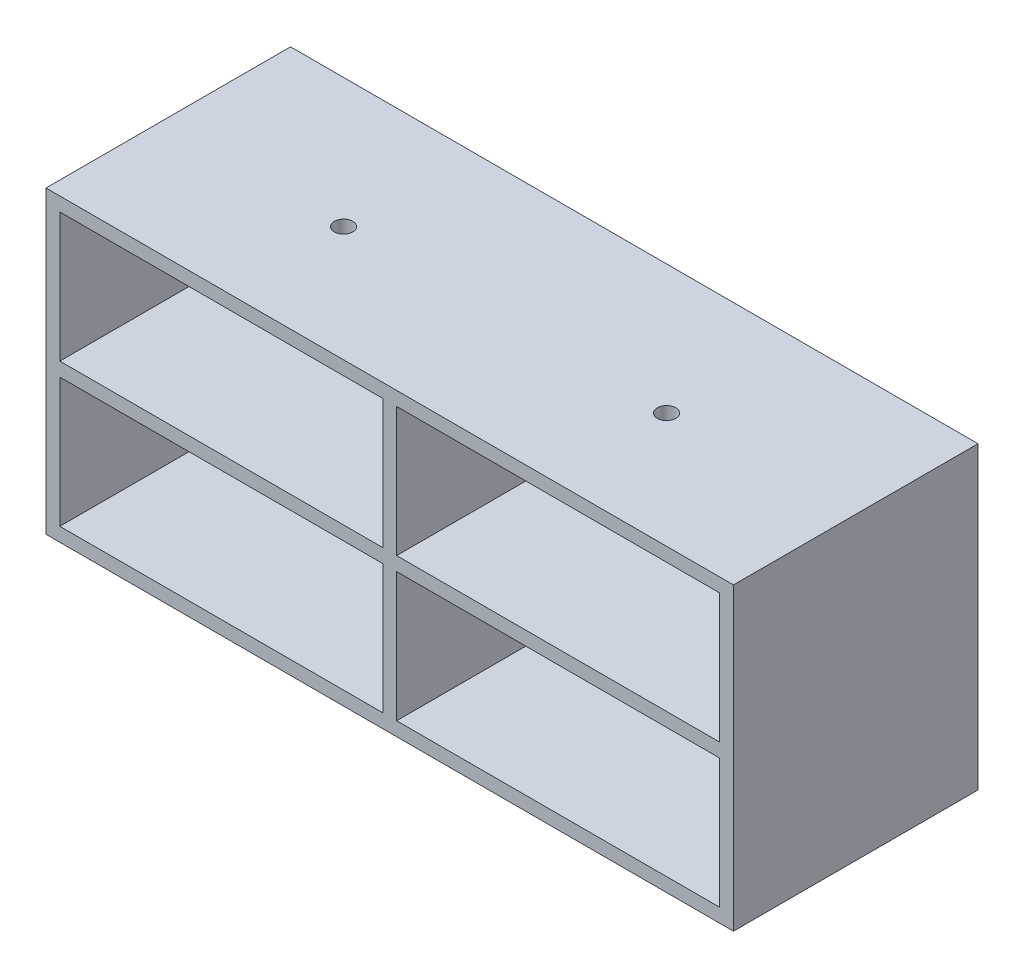
ISO-10303-21;
HEADER;
FILE_DESCRIPTION(('STEP AP214'),'2;1');
FILE_NAME('part.step','',(''),(''),'','','');
FILE_SCHEMA(('AUTOMOTIVE_DESIGN { 1 0 10303 214 1 1 1 1 }'));
ENDSEC;
DATA;
#1=APPLICATION_CONTEXT('core data for automotive mechanical design processes');
#2=APPLICATION_PROTOCOL_DEFINITION('international standard','automotive_design',2000,#1);
#3=PRODUCT_CONTEXT('',#1,'mechanical');
#4=PRODUCT('Part','Part','',(#3));
#5=PRODUCT_RELATED_PRODUCT_CATEGORY('part','',(#4));
#6=PRODUCT_DEFINITION_FORMATION('','',#4);
#7=PRODUCT_DEFINITION_CONTEXT('part definition',#1,'design');
#8=PRODUCT_DEFINITION('design','',#6,#7);
#9=PRODUCT_DEFINITION_SHAPE('','',#8);
#10=(LENGTH_UNIT() NAMED_UNIT(*) SI_UNIT(.MILLI.,.METRE.));
#11=(NAMED_UNIT(*) PLANE_ANGLE_UNIT() SI_UNIT($,.RADIAN.));
#12=(NAMED_UNIT(*) SI_UNIT($,.STERADIAN.) SOLID_ANGLE_UNIT());
#13=UNCERTAINTY_MEASURE_WITH_UNIT(LENGTH_MEASURE(1.E-05),#10,'distance_accuracy_value','');
#14=(GEOMETRIC_REPRESENTATION_CONTEXT(3) GLOBAL_UNCERTAINTY_ASSIGNED_CONTEXT((#13)) GLOBAL_UNIT_ASSIGNED_CONTEXT((#10,
#11,#12)) REPRESENTATION_CONTEXT('',''));
#15=CARTESIAN_POINT('',(0.,0.,0.));
#16=DIRECTION('',(0.,0.,1.));
#17=DIRECTION('',(1.,0.,0.));
#18=AXIS2_PLACEMENT_3D('',#15,#16,#17);
#19=CARTESIAN_POINT('',(146.,-62.,53.));
#20=DIRECTION('',(-1.,0.,0.));
#21=DIRECTION('',(0.,0.,1.));
#22=AXIS2_PLACEMENT_3D('',#19,#20,#21);
#23=PLANE('',#22);
#24=DIRECTION('',(0.,1.,0.));
#25=VECTOR('',#24,1.);
#26=CARTESIAN_POINT('',(146.,-62.,53.));
#27=LINE('',#26,#25);
#28=CARTESIAN_POINT('',(146.,-62.,53.));
#29=VERTEX_POINT('',#28);
#30=CARTESIAN_POINT('',(146.,-34.,53.));
#31=VERTEX_POINT('',#30);
#32=EDGE_CURVE('E250',#29,#31,#27,.T.);
#33=ORIENTED_EDGE('',*,*,#32,.T.);
#34=DIRECTION('',(0.,0.,-1.));
#35=VECTOR('',#34,1.);
#36=CARTESIAN_POINT('',(146.,-34.,207.693244842818));
#37=LINE('',#36,#35);
#38=CARTESIAN_POINT('',(146.,-34.,3.));
#39=VERTEX_POINT('',#38);
#40=EDGE_CURVE('E243',#31,#39,#37,.T.);
#41=ORIENTED_EDGE('',*,*,#40,.T.);
#42=DIRECTION('',(0.,1.,0.));
#43=VECTOR('',#42,1.);
#44=CARTESIAN_POINT('',(146.,-62.,3.));
#45=LINE('',#44,#43);
#46=CARTESIAN_POINT('',(146.,-62.,3.));
#47=VERTEX_POINT('',#46);
#48=EDGE_CURVE('E198',#47,#39,#45,.T.);
#49=ORIENTED_EDGE('',*,*,#48,.F.);
#50=DIRECTION('',(0.,0.,-1.));
#51=VECTOR('',#50,1.);
#52=CARTESIAN_POINT('',(146.,-62.,53.));
#53=LINE('',#52,#51);
#54=EDGE_CURVE('E263',#29,#47,#53,.T.);
#55=ORIENTED_EDGE('',*,*,#54,.F.);
#56=EDGE_LOOP('',(#33,#41,#49,#55));
#57=FACE_BOUND('',#56,.T.);
#58=ADVANCED_FACE('F37',(#57),#23,.T.);
#59=CARTESIAN_POINT('',(146.,-31.,3.));
#60=VERTEX_POINT('',#59);
#61=CARTESIAN_POINT('',(146.,-3.,3.));
#62=VERTEX_POINT('',#61);
#63=EDGE_CURVE('E59',#60,#62,#45,.T.);
#64=ORIENTED_EDGE('',*,*,#63,.F.);
#65=DIRECTION('',(0.,0.,-1.));
#66=VECTOR('',#65,1.);
#67=CARTESIAN_POINT('',(146.,-31.,207.693244842818));
#68=LINE('',#67,#66);
#69=CARTESIAN_POINT('',(146.,-31.,53.));
#70=VERTEX_POINT('',#69);
#71=EDGE_CURVE('E246',#70,#60,#68,.T.);
#72=ORIENTED_EDGE('',*,*,#71,.F.);
#73=CARTESIAN_POINT('',(146.,-3.,53.));
#74=VERTEX_POINT('',#73);
#75=EDGE_CURVE('E195',#70,#74,#27,.T.);
#76=ORIENTED_EDGE('',*,*,#75,.T.);
#77=DIRECTION('',(0.,0.,-1.));
#78=VECTOR('',#77,1.);
#79=CARTESIAN_POINT('',(146.,-3.,53.));
#80=LINE('',#79,#78);
#81=EDGE_CURVE('E285',#74,#62,#80,.T.);
#82=ORIENTED_EDGE('',*,*,#81,.T.);
#83=EDGE_LOOP('',(#64,#72,#76,#82));
#84=FACE_BOUND('',#83,.T.);
#85=ADVANCED_FACE('F341',(#84),#23,.T.);
#86=CARTESIAN_POINT('',(146.,-3.,53.));
#87=DIRECTION('',(0.,-1.,0.));
#88=DIRECTION('',(1.,0.,0.));
#89=AXIS2_PLACEMENT_3D('',#86,#87,#88);
#90=PLANE('',#89);
#91=CARTESIAN_POINT('',(39.5,-3.,28.));
#92=DIRECTION('',(0.,-1.,0.));
#93=DIRECTION('',(1.,0.,0.));
#94=AXIS2_PLACEMENT_3D('',#91,#92,#93);
#95=CIRCLE('',#94,2.);
#96=CARTESIAN_POINT('',(41.5,-3.,28.));
#97=VERTEX_POINT('',#96);
#98=EDGE_CURVE('E249',#97,#97,#95,.F.);
#99=ORIENTED_EDGE('',*,*,#98,.T.);
#100=EDGE_LOOP('',(#99));
#101=FACE_BOUND('',#100,.T.);
#102=DIRECTION('',(-1.,0.,0.));
#103=VECTOR('',#102,1.);
#104=CARTESIAN_POINT('',(146.,-3.,3.));
#105=LINE('',#104,#103);
#106=CARTESIAN_POINT('',(73.,-3.,3.));
#107=VERTEX_POINT('',#106);
#108=CARTESIAN_POINT('',(3.,-3.,3.));
#109=VERTEX_POINT('',#108);
#110=EDGE_CURVE('E266',#107,#109,#105,.T.);
#111=ORIENTED_EDGE('',*,*,#110,.F.);
#112=DIRECTION('',(0.,0.,-1.));
#113=VECTOR('',#112,1.);
#114=CARTESIAN_POINT('',(73.,-3.,207.693244842818));
#115=LINE('',#114,#113);
#116=CARTESIAN_POINT('',(73.,-3.,53.));
#117=VERTEX_POINT('',#116);
#118=EDGE_CURVE('E220',#117,#107,#115,.T.);
#119=ORIENTED_EDGE('',*,*,#118,.F.);
#120=DIRECTION('',(-1.,0.,0.));
#121=VECTOR('',#120,1.);
#122=CARTESIAN_POINT('',(146.,-3.,53.));
#123=LINE('',#122,#121);
#124=CARTESIAN_POINT('',(3.,-3.,53.));
#125=VERTEX_POINT('',#124);
#126=EDGE_CURVE('E253',#117,#125,#123,.T.);
#127=ORIENTED_EDGE('',*,*,#126,.T.);
#128=DIRECTION('',(0.,0.,-1.));
#129=VECTOR('',#128,1.);
#130=CARTESIAN_POINT('',(3.,-3.,53.));
#131=LINE('',#130,#129);
#132=EDGE_CURVE('E282',#125,#109,#131,.T.);
#133=ORIENTED_EDGE('',*,*,#132,.T.);
#134=EDGE_LOOP('',(#111,#119,#127,#133));
#135=FACE_BOUND('',#134,.T.);
#136=ADVANCED_FACE('F347',(#101,#135),#90,.T.);
#137=CARTESIAN_POINT('',(109.5,-3.,28.));
#138=DIRECTION('',(0.,-1.,0.));
#139=DIRECTION('',(1.,0.,0.));
#140=AXIS2_PLACEMENT_3D('',#137,#138,#139);
#141=CIRCLE('',#140,2.);
#142=CARTESIAN_POINT('',(111.5,-3.,28.));
#143=VERTEX_POINT('',#142);
#144=EDGE_CURVE('E375',#143,#143,#141,.F.);
#145=ORIENTED_EDGE('',*,*,#144,.T.);
#146=EDGE_LOOP('',(#145));
#147=FACE_BOUND('',#146,.T.);
#148=CARTESIAN_POINT('',(76.,-3.,53.));
#149=VERTEX_POINT('',#148);
#150=EDGE_CURVE('E254',#74,#149,#123,.T.);
#151=ORIENTED_EDGE('',*,*,#150,.T.);
#152=DIRECTION('',(0.,0.,-1.));
#153=VECTOR('',#152,1.);
#154=CARTESIAN_POINT('',(76.,-3.,207.693244842818));
#155=LINE('',#154,#153);
#156=CARTESIAN_POINT('',(76.,-3.,3.));
#157=VERTEX_POINT('',#156);
#158=EDGE_CURVE('E186',#149,#157,#155,.T.);
#159=ORIENTED_EDGE('',*,*,#158,.T.);
#160=EDGE_CURVE('E267',#62,#157,#105,.T.);
#161=ORIENTED_EDGE('',*,*,#160,.F.);
#162=ORIENTED_EDGE('',*,*,#81,.F.);
#163=EDGE_LOOP('',(#151,#159,#161,#162));
#164=FACE_BOUND('',#163,.T.);
#165=ADVANCED_FACE('F420',(#147,#164),#90,.T.);
#166=CARTESIAN_POINT('',(3.,-3.,53.));
#167=DIRECTION('',(1.,0.,0.));
#168=DIRECTION('',(0.,0.,-1.));
#169=AXIS2_PLACEMENT_3D('',#166,#167,#168);
#170=PLANE('',#169);
#171=DIRECTION('',(0.,-1.,0.));
#172=VECTOR('',#171,1.);
#173=CARTESIAN_POINT('',(3.,-3.,53.));
#174=LINE('',#173,#172);
#175=CARTESIAN_POINT('',(3.,-31.,53.));
#176=VERTEX_POINT('',#175);
#177=EDGE_CURVE('E257',#125,#176,#174,.T.);
#178=ORIENTED_EDGE('',*,*,#177,.T.);
#179=DIRECTION('',(0.,0.,-1.));
#180=VECTOR('',#179,1.);
#181=CARTESIAN_POINT('',(3.,-31.,207.693244842818));
#182=LINE('',#181,#180);
#183=CARTESIAN_POINT('',(3.,-31.,3.));
#184=VERTEX_POINT('',#183);
#185=EDGE_CURVE('E225',#176,#184,#182,.T.);
#186=ORIENTED_EDGE('',*,*,#185,.T.);
#187=DIRECTION('',(0.,-1.,0.));
#188=VECTOR('',#187,1.);
#189=CARTESIAN_POINT('',(3.,-3.,3.));
#190=LINE('',#189,#188);
#191=EDGE_CURVE('E270',#109,#184,#190,.T.);
#192=ORIENTED_EDGE('',*,*,#191,.F.);
#193=ORIENTED_EDGE('',*,*,#132,.F.);
#194=EDGE_LOOP('',(#178,#186,#192,#193));
#195=FACE_BOUND('',#194,.T.);
#196=ADVANCED_FACE('F397',(#195),#170,.T.);
#197=CARTESIAN_POINT('',(3.,-34.,3.));
#198=VERTEX_POINT('',#197);
#199=CARTESIAN_POINT('',(3.,-62.,3.));
#200=VERTEX_POINT('',#199);
#201=EDGE_CURVE('E269',#198,#200,#190,.T.);
#202=ORIENTED_EDGE('',*,*,#201,.F.);
#203=DIRECTION('',(0.,0.,-1.));
#204=VECTOR('',#203,1.);
#205=CARTESIAN_POINT('',(3.,-34.,207.693244842818));
#206=LINE('',#205,#204);
#207=CARTESIAN_POINT('',(3.,-34.,53.));
#208=VERTEX_POINT('',#207);
#209=EDGE_CURVE('E228',#208,#198,#206,.T.);
#210=ORIENTED_EDGE('',*,*,#209,.F.);
#211=CARTESIAN_POINT('',(3.,-62.,53.));
#212=VERTEX_POINT('',#211);
#213=EDGE_CURVE('E256',#208,#212,#174,.T.);
#214=ORIENTED_EDGE('',*,*,#213,.T.);
#215=DIRECTION('',(0.,0.,-1.));
#216=VECTOR('',#215,1.);
#217=CARTESIAN_POINT('',(3.,-62.,53.));
#218=LINE('',#217,#216);
#219=EDGE_CURVE('E279',#212,#200,#218,.T.);
#220=ORIENTED_EDGE('',*,*,#219,.T.);
#221=EDGE_LOOP('',(#202,#210,#214,#220));
#222=FACE_BOUND('',#221,.T.);
#223=ADVANCED_FACE('F417',(#222),#170,.T.);
#224=CARTESIAN_POINT('',(3.,-62.,53.));
#225=DIRECTION('',(0.,1.,0.));
#226=DIRECTION('',(-1.,0.,0.));
#227=AXIS2_PLACEMENT_3D('',#224,#225,#226);
#228=PLANE('',#227);
#229=DIRECTION('',(1.,0.,0.));
#230=VECTOR('',#229,1.);
#231=CARTESIAN_POINT('',(3.,-62.,53.));
#232=LINE('',#231,#230);
#233=CARTESIAN_POINT('',(73.,-62.,53.));
#234=VERTEX_POINT('',#233);
#235=EDGE_CURVE('E261',#212,#234,#232,.T.);
#236=ORIENTED_EDGE('',*,*,#235,.T.);
#237=DIRECTION('',(0.,0.,-1.));
#238=VECTOR('',#237,1.);
#239=CARTESIAN_POINT('',(73.,-62.,207.693244842818));
#240=LINE('',#239,#238);
#241=CARTESIAN_POINT('',(73.,-62.,3.));
#242=VERTEX_POINT('',#241);
#243=EDGE_CURVE('E234',#234,#242,#240,.T.);
#244=ORIENTED_EDGE('',*,*,#243,.T.);
#245=DIRECTION('',(1.,0.,0.));
#246=VECTOR('',#245,1.);
#247=CARTESIAN_POINT('',(3.,-62.,3.));
#248=LINE('',#247,#246);
#249=EDGE_CURVE('E274',#200,#242,#248,.T.);
#250=ORIENTED_EDGE('',*,*,#249,.F.);
#251=ORIENTED_EDGE('',*,*,#219,.F.);
#252=EDGE_LOOP('',(#236,#244,#250,#251));
#253=FACE_BOUND('',#252,.T.);
#254=ADVANCED_FACE('F415',(#253),#228,.T.);
#255=CARTESIAN_POINT('',(76.,-62.,3.));
#256=VERTEX_POINT('',#255);
#257=EDGE_CURVE('E273',#256,#47,#248,.T.);
#258=ORIENTED_EDGE('',*,*,#257,.F.);
#259=DIRECTION('',(0.,0.,-1.));
#260=VECTOR('',#259,1.);
#261=CARTESIAN_POINT('',(76.,-62.,207.693244842818));
#262=LINE('',#261,#260);
#263=CARTESIAN_POINT('',(76.,-62.,53.));
#264=VERTEX_POINT('',#263);
#265=EDGE_CURVE('E237',#264,#256,#262,.T.);
#266=ORIENTED_EDGE('',*,*,#265,.F.);
#267=EDGE_CURVE('E260',#264,#29,#232,.T.);
#268=ORIENTED_EDGE('',*,*,#267,.T.);
#269=ORIENTED_EDGE('',*,*,#54,.T.);
#270=EDGE_LOOP('',(#258,#266,#268,#269));
#271=FACE_BOUND('',#270,.T.);
#272=ADVANCED_FACE('F359',(#271),#228,.T.);
#273=CARTESIAN_POINT('',(0.,0.,3.));
#274=DIRECTION('',(0.,0.,1.));
#275=DIRECTION('',(1.,0.,0.));
#276=AXIS2_PLACEMENT_3D('',#273,#274,#275);
#277=PLANE('',#276);
#278=DIRECTION('',(-1.,0.,0.));
#279=VECTOR('',#278,1.);
#280=CARTESIAN_POINT('',(73.,-31.,3.));
#281=LINE('',#280,#279);
#282=CARTESIAN_POINT('',(73.,-31.,3.));
#283=VERTEX_POINT('',#282);
#284=EDGE_CURVE('E224',#283,#184,#281,.T.);
#285=ORIENTED_EDGE('',*,*,#284,.F.);
#286=DIRECTION('',(0.,-1.,0.));
#287=VECTOR('',#286,1.);
#288=CARTESIAN_POINT('',(73.,-3.,3.));
#289=LINE('',#288,#287);
#290=EDGE_CURVE('E204',#107,#283,#289,.T.);
#291=ORIENTED_EDGE('',*,*,#290,.F.);
#292=ORIENTED_EDGE('',*,*,#110,.T.);
#293=ORIENTED_EDGE('',*,*,#191,.T.);
#294=EDGE_LOOP('',(#285,#291,#292,#293));
#295=FACE_BOUND('',#294,.T.);
#296=ADVANCED_FACE('F355',(#295),#277,.T.);
#297=DIRECTION('',(0.,-1.,0.));
#298=VECTOR('',#297,1.);
#299=CARTESIAN_POINT('',(73.,-34.,3.));
#300=LINE('',#299,#298);
#301=CARTESIAN_POINT('',(73.,-34.,3.));
#302=VERTEX_POINT('',#301);
#303=EDGE_CURVE('E233',#302,#242,#300,.T.);
#304=ORIENTED_EDGE('',*,*,#303,.F.);
#305=DIRECTION('',(1.,0.,0.));
#306=VECTOR('',#305,1.);
#307=CARTESIAN_POINT('',(3.,-34.,3.));
#308=LINE('',#307,#306);
#309=EDGE_CURVE('E230',#198,#302,#308,.T.);
#310=ORIENTED_EDGE('',*,*,#309,.F.);
#311=ORIENTED_EDGE('',*,*,#201,.T.);
#312=ORIENTED_EDGE('',*,*,#249,.T.);
#313=EDGE_LOOP('',(#304,#310,#311,#312));
#314=FACE_BOUND('',#313,.T.);
#315=ADVANCED_FACE('F358',(#314),#277,.T.);
#316=DIRECTION('',(1.,0.,0.));
#317=VECTOR('',#316,1.);
#318=CARTESIAN_POINT('',(76.,-34.,3.));
#319=LINE('',#318,#317);
#320=CARTESIAN_POINT('',(76.,-34.,3.));
#321=VERTEX_POINT('',#320);
#322=EDGE_CURVE('E242',#321,#39,#319,.T.);
#323=ORIENTED_EDGE('',*,*,#322,.F.);
#324=DIRECTION('',(0.,1.,0.));
#325=VECTOR('',#324,1.);
#326=CARTESIAN_POINT('',(76.,-62.,3.));
#327=LINE('',#326,#325);
#328=EDGE_CURVE('E239',#256,#321,#327,.T.);
#329=ORIENTED_EDGE('',*,*,#328,.F.);
#330=ORIENTED_EDGE('',*,*,#257,.T.);
#331=ORIENTED_EDGE('',*,*,#48,.T.);
#332=EDGE_LOOP('',(#323,#329,#330,#331));
#333=FACE_BOUND('',#332,.T.);
#334=ADVANCED_FACE('F435',(#333),#277,.T.);
#335=DIRECTION('',(0.,1.,0.));
#336=VECTOR('',#335,1.);
#337=CARTESIAN_POINT('',(76.,-31.,3.));
#338=LINE('',#337,#336);
#339=CARTESIAN_POINT('',(76.,-31.,3.));
#340=VERTEX_POINT('',#339);
#341=EDGE_CURVE('E180',#340,#157,#338,.T.);
#342=ORIENTED_EDGE('',*,*,#341,.F.);
#343=DIRECTION('',(-1.,0.,0.));
#344=VECTOR('',#343,1.);
#345=CARTESIAN_POINT('',(146.,-31.,3.));
#346=LINE('',#345,#344);
#347=EDGE_CURVE('E52',#60,#340,#346,.T.);
#348=ORIENTED_EDGE('',*,*,#347,.F.);
#349=ORIENTED_EDGE('',*,*,#63,.T.);
#350=ORIENTED_EDGE('',*,*,#160,.T.);
#351=EDGE_LOOP('',(#342,#348,#349,#350));
#352=FACE_BOUND('',#351,.T.);
#353=ADVANCED_FACE('F339',(#352),#277,.T.);
#354=CARTESIAN_POINT('',(0.,0.,3.));
#355=DIRECTION('',(1.,0.,0.));
#356=DIRECTION('',(0.,1.,0.));
#357=AXIS2_PLACEMENT_3D('',#354,#355,#356);
#358=PLANE('',#357);
#359=DIRECTION('',(0.,-1.,0.));
#360=VECTOR('',#359,1.);
#361=CARTESIAN_POINT('',(0.,0.,0.));
#362=LINE('',#361,#360);
#363=CARTESIAN_POINT('',(0.,0.,0.));
#364=VERTEX_POINT('',#363);
#365=CARTESIAN_POINT('',(0.,-65.,0.));
#366=VERTEX_POINT('',#365);
#367=EDGE_CURVE('E300',#364,#366,#362,.T.);
#368=ORIENTED_EDGE('',*,*,#367,.T.);
#369=DIRECTION('',(0.,0.,-1.));
#370=VECTOR('',#369,1.);
#371=CARTESIAN_POINT('',(0.,-65.,3.));
#372=LINE('',#371,#370);
#373=CARTESIAN_POINT('',(0.,-65.,53.));
#374=VERTEX_POINT('',#373);
#375=EDGE_CURVE('E11',#374,#366,#372,.T.);
#376=ORIENTED_EDGE('',*,*,#375,.F.);
#377=DIRECTION('',(0.,-1.,0.));
#378=VECTOR('',#377,1.);
#379=CARTESIAN_POINT('',(0.,0.,53.));
#380=LINE('',#379,#378);
#381=CARTESIAN_POINT('',(0.,0.,53.));
#382=VERTEX_POINT('',#381);
#383=EDGE_CURVE('E291',#382,#374,#380,.T.);
#384=ORIENTED_EDGE('',*,*,#383,.F.);
#385=DIRECTION('',(0.,0.,-1.));
#386=VECTOR('',#385,1.);
#387=CARTESIAN_POINT('',(0.,0.,3.));
#388=LINE('',#387,#386);
#389=EDGE_CURVE('E309',#382,#364,#388,.T.);
#390=ORIENTED_EDGE('',*,*,#389,.T.);
#391=EDGE_LOOP('',(#368,#376,#384,#390));
#392=FACE_BOUND('',#391,.T.);
#393=ADVANCED_FACE('F39',(#392),#358,.F.);
#394=CARTESIAN_POINT('',(0.,-65.,3.));
#395=DIRECTION('',(0.,1.,0.));
#396=DIRECTION('',(0.,0.,1.));
#397=AXIS2_PLACEMENT_3D('',#394,#395,#396);
#398=PLANE('',#397);
#399=DIRECTION('',(1.,0.,0.));
#400=VECTOR('',#399,1.);
#401=CARTESIAN_POINT('',(0.,-65.,0.));
#402=LINE('',#401,#400);
#403=CARTESIAN_POINT('',(149.,-65.,0.));
#404=VERTEX_POINT('',#403);
#405=EDGE_CURVE('E303',#366,#404,#402,.T.);
#406=ORIENTED_EDGE('',*,*,#405,.T.);
#407=DIRECTION('',(0.,0.,-1.));
#408=VECTOR('',#407,1.);
#409=CARTESIAN_POINT('',(149.,-65.,3.));
#410=LINE('',#409,#408);
#411=CARTESIAN_POINT('',(149.,-65.,53.));
#412=VERTEX_POINT('',#411);
#413=EDGE_CURVE('E45',#412,#404,#410,.T.);
#414=ORIENTED_EDGE('',*,*,#413,.F.);
#415=DIRECTION('',(1.,0.,0.));
#416=VECTOR('',#415,1.);
#417=CARTESIAN_POINT('',(0.,-65.,53.));
#418=LINE('',#417,#416);
#419=EDGE_CURVE('E294',#374,#412,#418,.T.);
#420=ORIENTED_EDGE('',*,*,#419,.F.);
#421=ORIENTED_EDGE('',*,*,#375,.T.);
#422=EDGE_LOOP('',(#406,#414,#420,#421));
#423=FACE_BOUND('',#422,.T.);
#424=ADVANCED_FACE('F332',(#423),#398,.F.);
#425=CARTESIAN_POINT('',(149.,0.,3.));
#426=DIRECTION('',(-1.,0.,0.));
#427=DIRECTION('',(0.,-1.,0.));
#428=AXIS2_PLACEMENT_3D('',#425,#426,#427);
#429=PLANE('',#428);
#430=DIRECTION('',(0.,1.,0.));
#431=VECTOR('',#430,1.);
#432=CARTESIAN_POINT('',(149.,0.,0.));
#433=LINE('',#432,#431);
#434=CARTESIAN_POINT('',(149.,0.,0.));
#435=VERTEX_POINT('',#434);
#436=EDGE_CURVE('E305',#404,#435,#433,.T.);
#437=ORIENTED_EDGE('',*,*,#436,.T.);
#438=DIRECTION('',(0.,0.,-1.));
#439=VECTOR('',#438,1.);
#440=CARTESIAN_POINT('',(149.,0.,3.));
#441=LINE('',#440,#439);
#442=CARTESIAN_POINT('',(149.,0.,53.));
#443=VERTEX_POINT('',#442);
#444=EDGE_CURVE('E312',#443,#435,#441,.T.);
#445=ORIENTED_EDGE('',*,*,#444,.F.);
#446=DIRECTION('',(0.,1.,0.));
#447=VECTOR('',#446,1.);
#448=CARTESIAN_POINT('',(149.,-65.,53.));
#449=LINE('',#448,#447);
#450=EDGE_CURVE('E297',#412,#443,#449,.T.);
#451=ORIENTED_EDGE('',*,*,#450,.F.);
#452=ORIENTED_EDGE('',*,*,#413,.T.);
#453=EDGE_LOOP('',(#437,#445,#451,#452));
#454=FACE_BOUND('',#453,.T.);
#455=ADVANCED_FACE('F318',(#454),#429,.F.);
#456=CARTESIAN_POINT('',(0.,0.,3.));
#457=DIRECTION('',(0.,-1.,0.));
#458=DIRECTION('',(0.,0.,-1.));
#459=AXIS2_PLACEMENT_3D('',#456,#457,#458);
#460=PLANE('',#459);
#461=CARTESIAN_POINT('',(39.5,0.,28.));
#462=DIRECTION('',(0.,1.,0.));
#463=DIRECTION('',(0.,0.,1.));
#464=AXIS2_PLACEMENT_3D('',#461,#462,#463);
#465=CIRCLE('',#464,2.);
#466=CARTESIAN_POINT('',(39.5,0.,30.));
#467=VERTEX_POINT('',#466);
#468=EDGE_CURVE('E370',#467,#467,#465,.T.);
#469=ORIENTED_EDGE('',*,*,#468,.F.);
#470=EDGE_LOOP('',(#469));
#471=FACE_BOUND('',#470,.T.);
#472=CARTESIAN_POINT('',(109.5,0.,28.));
#473=DIRECTION('',(0.,1.,0.));
#474=DIRECTION('',(0.,0.,1.));
#475=AXIS2_PLACEMENT_3D('',#472,#473,#474);
#476=CIRCLE('',#475,2.);
#477=CARTESIAN_POINT('',(109.5,0.,30.));
#478=VERTEX_POINT('',#477);
#479=EDGE_CURVE('E373',#478,#478,#476,.T.);
#480=ORIENTED_EDGE('',*,*,#479,.F.);
#481=EDGE_LOOP('',(#480));
#482=FACE_BOUND('',#481,.T.);
#483=DIRECTION('',(-1.,0.,0.));
#484=VECTOR('',#483,1.);
#485=CARTESIAN_POINT('',(0.,0.,0.));
#486=LINE('',#485,#484);
#487=EDGE_CURVE('E307',#435,#364,#486,.T.);
#488=ORIENTED_EDGE('',*,*,#487,.T.);
#489=ORIENTED_EDGE('',*,*,#389,.F.);
#490=DIRECTION('',(-1.,0.,0.));
#491=VECTOR('',#490,1.);
#492=CARTESIAN_POINT('',(149.,0.,53.));
#493=LINE('',#492,#491);
#494=EDGE_CURVE('E288',#443,#382,#493,.T.);
#495=ORIENTED_EDGE('',*,*,#494,.F.);
#496=ORIENTED_EDGE('',*,*,#444,.T.);
#497=EDGE_LOOP('',(#488,#489,#495,#496));
#498=FACE_BOUND('',#497,.T.);
#499=ADVANCED_FACE('F326',(#471,#482,#498),#460,.F.);
#500=CARTESIAN_POINT('',(0.,0.,0.));
#501=DIRECTION('',(0.,0.,1.));
#502=DIRECTION('',(1.,0.,0.));
#503=AXIS2_PLACEMENT_3D('',#500,#501,#502);
#504=PLANE('',#503);
#505=ORIENTED_EDGE('',*,*,#367,.F.);
#506=ORIENTED_EDGE('',*,*,#487,.F.);
#507=ORIENTED_EDGE('',*,*,#436,.F.);
#508=ORIENTED_EDGE('',*,*,#405,.F.);
#509=EDGE_LOOP('',(#505,#506,#507,#508));
#510=FACE_BOUND('',#509,.T.);
#511=ADVANCED_FACE('F324',(#510),#504,.F.);
#512=CARTESIAN_POINT('',(0.,0.,53.));
#513=DIRECTION('',(0.,0.,1.));
#514=DIRECTION('',(1.,0.,0.));
#515=AXIS2_PLACEMENT_3D('',#512,#513,#514);
#516=PLANE('',#515);
#517=ORIENTED_EDGE('',*,*,#75,.F.);
#518=DIRECTION('',(-1.,0.,0.));
#519=VECTOR('',#518,1.);
#520=CARTESIAN_POINT('',(146.,-31.,53.));
#521=LINE('',#520,#519);
#522=CARTESIAN_POINT('',(76.,-31.,53.));
#523=VERTEX_POINT('',#522);
#524=EDGE_CURVE('E176',#70,#523,#521,.T.);
#525=ORIENTED_EDGE('',*,*,#524,.T.);
#526=DIRECTION('',(0.,1.,0.));
#527=VECTOR('',#526,1.);
#528=CARTESIAN_POINT('',(76.,-31.,53.));
#529=LINE('',#528,#527);
#530=EDGE_CURVE('E183',#523,#149,#529,.T.);
#531=ORIENTED_EDGE('',*,*,#530,.T.);
#532=ORIENTED_EDGE('',*,*,#150,.F.);
#533=EDGE_LOOP('',(#517,#525,#531,#532));
#534=FACE_BOUND('',#533,.T.);
#535=ORIENTED_EDGE('',*,*,#126,.F.);
#536=DIRECTION('',(0.,-1.,0.));
#537=VECTOR('',#536,1.);
#538=CARTESIAN_POINT('',(73.,-3.,53.));
#539=LINE('',#538,#537);
#540=CARTESIAN_POINT('',(73.,-31.,53.));
#541=VERTEX_POINT('',#540);
#542=EDGE_CURVE('E190',#117,#541,#539,.T.);
#543=ORIENTED_EDGE('',*,*,#542,.T.);
#544=DIRECTION('',(-1.,0.,0.));
#545=VECTOR('',#544,1.);
#546=CARTESIAN_POINT('',(73.,-31.,53.));
#547=LINE('',#546,#545);
#548=EDGE_CURVE('E215',#541,#176,#547,.T.);
#549=ORIENTED_EDGE('',*,*,#548,.T.);
#550=ORIENTED_EDGE('',*,*,#177,.F.);
#551=EDGE_LOOP('',(#535,#543,#549,#550));
#552=FACE_BOUND('',#551,.T.);
#553=ORIENTED_EDGE('',*,*,#213,.F.);
#554=DIRECTION('',(1.,0.,0.));
#555=VECTOR('',#554,1.);
#556=CARTESIAN_POINT('',(3.,-34.,53.));
#557=LINE('',#556,#555);
#558=CARTESIAN_POINT('',(73.,-34.,53.));
#559=VERTEX_POINT('',#558);
#560=EDGE_CURVE('E212',#208,#559,#557,.T.);
#561=ORIENTED_EDGE('',*,*,#560,.T.);
#562=DIRECTION('',(0.,-1.,0.));
#563=VECTOR('',#562,1.);
#564=CARTESIAN_POINT('',(73.,-34.,53.));
#565=LINE('',#564,#563);
#566=EDGE_CURVE('E209',#559,#234,#565,.T.);
#567=ORIENTED_EDGE('',*,*,#566,.T.);
#568=ORIENTED_EDGE('',*,*,#235,.F.);
#569=EDGE_LOOP('',(#553,#561,#567,#568));
#570=FACE_BOUND('',#569,.T.);
#571=ORIENTED_EDGE('',*,*,#494,.T.);
#572=ORIENTED_EDGE('',*,*,#383,.T.);
#573=ORIENTED_EDGE('',*,*,#419,.T.);
#574=ORIENTED_EDGE('',*,*,#450,.T.);
#575=EDGE_LOOP('',(#571,#572,#573,#574));
#576=FACE_BOUND('',#575,.T.);
#577=DIRECTION('',(1.,0.,0.));
#578=VECTOR('',#577,1.);
#579=CARTESIAN_POINT('',(76.,-34.,53.));
#580=LINE('',#579,#578);
#581=CARTESIAN_POINT('',(76.,-34.,53.));
#582=VERTEX_POINT('',#581);
#583=EDGE_CURVE('E196',#582,#31,#580,.T.);
#584=ORIENTED_EDGE('',*,*,#583,.T.);
#585=ORIENTED_EDGE('',*,*,#32,.F.);
#586=ORIENTED_EDGE('',*,*,#267,.F.);
#587=DIRECTION('',(0.,1.,0.));
#588=VECTOR('',#587,1.);
#589=CARTESIAN_POINT('',(76.,-62.,53.));
#590=LINE('',#589,#588);
#591=EDGE_CURVE('E201',#264,#582,#590,.T.);
#592=ORIENTED_EDGE('',*,*,#591,.T.);
#593=EDGE_LOOP('',(#584,#585,#586,#592));
#594=FACE_BOUND('',#593,.T.);
#595=ADVANCED_FACE('F193',(#534,#552,#570,#576,#594),#516,.T.);
#596=CARTESIAN_POINT('',(73.,-3.,207.693244842818));
#597=DIRECTION('',(1.,0.,0.));
#598=DIRECTION('',(0.,0.,-1.));
#599=AXIS2_PLACEMENT_3D('',#596,#597,#598);
#600=PLANE('',#599);
#601=ORIENTED_EDGE('',*,*,#542,.F.);
#602=ORIENTED_EDGE('',*,*,#118,.T.);
#603=ORIENTED_EDGE('',*,*,#290,.T.);
#604=DIRECTION('',(0.,0.,-1.));
#605=VECTOR('',#604,1.);
#606=CARTESIAN_POINT('',(73.,-31.,207.693244842818));
#607=LINE('',#606,#605);
#608=EDGE_CURVE('E222',#541,#283,#607,.T.);
#609=ORIENTED_EDGE('',*,*,#608,.F.);
#610=EDGE_LOOP('',(#601,#602,#603,#609));
#611=FACE_BOUND('',#610,.T.);
#612=ADVANCED_FACE('F354',(#611),#600,.F.);
#613=CARTESIAN_POINT('',(73.,-31.,207.693244842818));
#614=DIRECTION('',(0.,-1.,0.));
#615=DIRECTION('',(1.,0.,0.));
#616=AXIS2_PLACEMENT_3D('',#613,#614,#615);
#617=PLANE('',#616);
#618=ORIENTED_EDGE('',*,*,#548,.F.);
#619=ORIENTED_EDGE('',*,*,#608,.T.);
#620=ORIENTED_EDGE('',*,*,#284,.T.);
#621=ORIENTED_EDGE('',*,*,#185,.F.);
#622=EDGE_LOOP('',(#618,#619,#620,#621));
#623=FACE_BOUND('',#622,.T.);
#624=ADVANCED_FACE('F391',(#623),#617,.F.);
#625=CARTESIAN_POINT('',(3.,-34.,207.693244842818));
#626=DIRECTION('',(0.,1.,0.));
#627=DIRECTION('',(0.,0.,1.));
#628=AXIS2_PLACEMENT_3D('',#625,#626,#627);
#629=PLANE('',#628);
#630=ORIENTED_EDGE('',*,*,#560,.F.);
#631=ORIENTED_EDGE('',*,*,#209,.T.);
#632=ORIENTED_EDGE('',*,*,#309,.T.);
#633=DIRECTION('',(0.,0.,-1.));
#634=VECTOR('',#633,1.);
#635=CARTESIAN_POINT('',(73.,-34.,207.693244842818));
#636=LINE('',#635,#634);
#637=EDGE_CURVE('E231',#559,#302,#636,.T.);
#638=ORIENTED_EDGE('',*,*,#637,.F.);
#639=EDGE_LOOP('',(#630,#631,#632,#638));
#640=FACE_BOUND('',#639,.T.);
#641=ADVANCED_FACE('F411',(#640),#629,.F.);
#642=CARTESIAN_POINT('',(73.,-34.,207.693244842818));
#643=DIRECTION('',(1.,0.,0.));
#644=DIRECTION('',(0.,0.,-1.));
#645=AXIS2_PLACEMENT_3D('',#642,#643,#644);
#646=PLANE('',#645);
#647=ORIENTED_EDGE('',*,*,#566,.F.);
#648=ORIENTED_EDGE('',*,*,#637,.T.);
#649=ORIENTED_EDGE('',*,*,#303,.T.);
#650=ORIENTED_EDGE('',*,*,#243,.F.);
#651=EDGE_LOOP('',(#647,#648,#649,#650));
#652=FACE_BOUND('',#651,.T.);
#653=ADVANCED_FACE('F509',(#652),#646,.F.);
#654=CARTESIAN_POINT('',(76.,-62.,207.693244842818));
#655=DIRECTION('',(-1.,0.,0.));
#656=DIRECTION('',(0.,0.,1.));
#657=AXIS2_PLACEMENT_3D('',#654,#655,#656);
#658=PLANE('',#657);
#659=ORIENTED_EDGE('',*,*,#591,.F.);
#660=ORIENTED_EDGE('',*,*,#265,.T.);
#661=ORIENTED_EDGE('',*,*,#328,.T.);
#662=DIRECTION('',(0.,0.,-1.));
#663=VECTOR('',#662,1.);
#664=CARTESIAN_POINT('',(76.,-34.,207.693244842818));
#665=LINE('',#664,#663);
#666=EDGE_CURVE('E240',#582,#321,#665,.T.);
#667=ORIENTED_EDGE('',*,*,#666,.F.);
#668=EDGE_LOOP('',(#659,#660,#661,#667));
#669=FACE_BOUND('',#668,.T.);
#670=ADVANCED_FACE('F455',(#669),#658,.F.);
#671=CARTESIAN_POINT('',(76.,-34.,207.693244842818));
#672=DIRECTION('',(0.,1.,0.));
#673=DIRECTION('',(-1.,0.,0.));
#674=AXIS2_PLACEMENT_3D('',#671,#672,#673);
#675=PLANE('',#674);
#676=ORIENTED_EDGE('',*,*,#583,.F.);
#677=ORIENTED_EDGE('',*,*,#666,.T.);
#678=ORIENTED_EDGE('',*,*,#322,.T.);
#679=ORIENTED_EDGE('',*,*,#40,.F.);
#680=EDGE_LOOP('',(#676,#677,#678,#679));
#681=FACE_BOUND('',#680,.T.);
#682=ADVANCED_FACE('F449',(#681),#675,.F.);
#683=CARTESIAN_POINT('',(146.,-31.,207.693244842818));
#684=DIRECTION('',(0.,-1.,0.));
#685=DIRECTION('',(1.,0.,0.));
#686=AXIS2_PLACEMENT_3D('',#683,#684,#685);
#687=PLANE('',#686);
#688=ORIENTED_EDGE('',*,*,#524,.F.);
#689=ORIENTED_EDGE('',*,*,#71,.T.);
#690=ORIENTED_EDGE('',*,*,#347,.T.);
#691=DIRECTION('',(0.,0.,-1.));
#692=VECTOR('',#691,1.);
#693=CARTESIAN_POINT('',(76.,-31.,207.693244842818));
#694=LINE('',#693,#692);
#695=EDGE_CURVE('E172',#523,#340,#694,.T.);
#696=ORIENTED_EDGE('',*,*,#695,.F.);
#697=EDGE_LOOP('',(#688,#689,#690,#696));
#698=FACE_BOUND('',#697,.T.);
#699=ADVANCED_FACE('F174',(#698),#687,.F.);
#700=CARTESIAN_POINT('',(76.,-31.,207.693244842818));
#701=DIRECTION('',(-1.,0.,0.));
#702=DIRECTION('',(0.,0.,1.));
#703=AXIS2_PLACEMENT_3D('',#700,#701,#702);
#704=PLANE('',#703);
#705=ORIENTED_EDGE('',*,*,#530,.F.);
#706=ORIENTED_EDGE('',*,*,#695,.T.);
#707=ORIENTED_EDGE('',*,*,#341,.T.);
#708=ORIENTED_EDGE('',*,*,#158,.F.);
#709=EDGE_LOOP('',(#705,#706,#707,#708));
#710=FACE_BOUND('',#709,.T.);
#711=ADVANCED_FACE('F184',(#710),#704,.F.);
#712=CARTESIAN_POINT('',(109.5,-8.65685424949239,28.));
#713=DIRECTION('',(0.,1.,0.));
#714=DIRECTION('',(0.,0.,1.));
#715=AXIS2_PLACEMENT_3D('',#712,#713,#714);
#716=CYLINDRICAL_SURFACE('',#715,2.);
#717=ORIENTED_EDGE('',*,*,#479,.T.);
#718=EDGE_LOOP('',(#717));
#719=FACE_BOUND('',#718,.T.);
#720=ORIENTED_EDGE('',*,*,#144,.F.);
#721=EDGE_LOOP('',(#720));
#722=FACE_BOUND('',#721,.T.);
#723=ADVANCED_FACE('F556',(#719,#722),#716,.F.);
#724=CARTESIAN_POINT('',(39.5,-8.65685424949239,28.));
#725=DIRECTION('',(0.,1.,0.));
#726=DIRECTION('',(0.,0.,1.));
#727=AXIS2_PLACEMENT_3D('',#724,#725,#726);
#728=CYLINDRICAL_SURFACE('',#727,2.);
#729=ORIENTED_EDGE('',*,*,#468,.T.);
#730=EDGE_LOOP('',(#729));
#731=FACE_BOUND('',#730,.T.);
#732=ORIENTED_EDGE('',*,*,#98,.F.);
#733=EDGE_LOOP('',(#732));
#734=FACE_BOUND('',#733,.T.);
#735=ADVANCED_FACE('F584',(#731,#734),#728,.F.);
#736=CLOSED_SHELL('',(#58,#85,#136,#165,#196,#223,#254,#272,#296,#315,#334,#353,#393,#424,#455,
#499,#511,#595,#612,#624,#641,#653,#670,#682,#699,#711,#723,#735));
#737=MANIFOLD_SOLID_BREP('B2',#736);
#738=ADVANCED_BREP_SHAPE_REPRESENTATION('',(#18,#737),#14);
#739=SHAPE_DEFINITION_REPRESENTATION(#9,#738);
ENDSEC;
END-ISO-10303-21;
